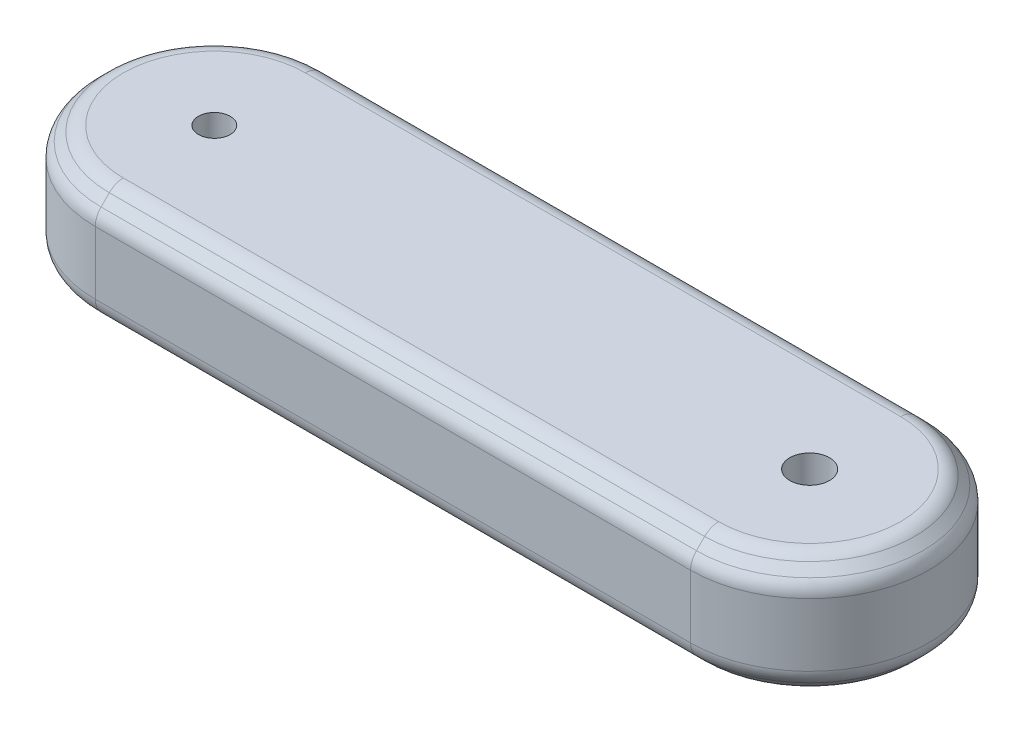
ISO-10303-21;
HEADER;
FILE_DESCRIPTION(('STEP AP214'),'2;1');
FILE_NAME('part.step','',(''),(''),'','','');
FILE_SCHEMA(('AUTOMOTIVE_DESIGN { 1 0 10303 214 1 1 1 1 }'));
ENDSEC;
DATA;
#1=APPLICATION_CONTEXT('core data for automotive mechanical design processes');
#2=APPLICATION_PROTOCOL_DEFINITION('international standard','automotive_design',2000,#1);
#3=PRODUCT_CONTEXT('',#1,'mechanical');
#4=PRODUCT('Part','Part','',(#3));
#5=PRODUCT_RELATED_PRODUCT_CATEGORY('part','',(#4));
#6=PRODUCT_DEFINITION_FORMATION('','',#4);
#7=PRODUCT_DEFINITION_CONTEXT('part definition',#1,'design');
#8=PRODUCT_DEFINITION('design','',#6,#7);
#9=PRODUCT_DEFINITION_SHAPE('','',#8);
#10=(LENGTH_UNIT() NAMED_UNIT(*) SI_UNIT(.MILLI.,.METRE.));
#11=(NAMED_UNIT(*) PLANE_ANGLE_UNIT() SI_UNIT($,.RADIAN.));
#12=(NAMED_UNIT(*) SI_UNIT($,.STERADIAN.) SOLID_ANGLE_UNIT());
#13=UNCERTAINTY_MEASURE_WITH_UNIT(LENGTH_MEASURE(1.E-05),#10,'distance_accuracy_value','');
#14=(GEOMETRIC_REPRESENTATION_CONTEXT(3) GLOBAL_UNCERTAINTY_ASSIGNED_CONTEXT((#13)) GLOBAL_UNIT_ASSIGNED_CONTEXT((#10,
#11,#12)) REPRESENTATION_CONTEXT('',''));
#15=CARTESIAN_POINT('',(0.,0.,0.));
#16=DIRECTION('',(0.,0.,1.));
#17=DIRECTION('',(1.,0.,0.));
#18=AXIS2_PLACEMENT_3D('',#15,#16,#17);
#19=CARTESIAN_POINT('',(-75.,30.,0.));
#20=DIRECTION('',(0.,-1.,0.));
#21=DIRECTION('',(0.,0.,-1.));
#22=AXIS2_PLACEMENT_3D('',#19,#20,#21);
#23=CYLINDRICAL_SURFACE('',#22,30.);
#24=DIRECTION('',(0.,-1.,0.));
#25=VECTOR('',#24,1.);
#26=CARTESIAN_POINT('',(-75.,30.,30.));
#27=LINE('',#26,#25);
#28=CARTESIAN_POINT('',(-75.,22.9289321881345,30.));
#29=VERTEX_POINT('',#28);
#30=CARTESIAN_POINT('',(-75.,7.07106781186547,30.));
#31=VERTEX_POINT('',#30);
#32=EDGE_CURVE('E194',#29,#31,#27,.T.);
#33=ORIENTED_EDGE('',*,*,#32,.F.);
#34=CARTESIAN_POINT('',(-75.,22.9289321881345,0.));
#35=DIRECTION('',(0.,1.,0.));
#36=DIRECTION('',(0.,0.,1.));
#37=AXIS2_PLACEMENT_3D('',#34,#35,#36);
#38=CIRCLE('',#37,30.);
#39=CARTESIAN_POINT('',(-75.,22.9289321881345,-30.));
#40=VERTEX_POINT('',#39);
#41=EDGE_CURVE('E269',#29,#40,#38,.F.);
#42=ORIENTED_EDGE('',*,*,#41,.T.);
#43=DIRECTION('',(0.,-1.,0.));
#44=VECTOR('',#43,1.);
#45=CARTESIAN_POINT('',(-75.,30.,-30.));
#46=LINE('',#45,#44);
#47=CARTESIAN_POINT('',(-75.,7.07106781186549,-30.));
#48=VERTEX_POINT('',#47);
#49=EDGE_CURVE('E182',#40,#48,#46,.T.);
#50=ORIENTED_EDGE('',*,*,#49,.T.);
#51=CARTESIAN_POINT('',(-75.,7.07106781186547,0.));
#52=DIRECTION('',(0.,-1.,0.));
#53=DIRECTION('',(0.,0.,-1.));
#54=AXIS2_PLACEMENT_3D('',#51,#52,#53);
#55=CIRCLE('',#54,30.);
#56=EDGE_CURVE('E267',#48,#31,#55,.F.);
#57=ORIENTED_EDGE('',*,*,#56,.T.);
#58=EDGE_LOOP('',(#33,#42,#50,#57));
#59=FACE_BOUND('',#58,.T.);
#60=ADVANCED_FACE('F37',(#59),#23,.T.);
#61=CARTESIAN_POINT('',(-75.,30.,30.));
#62=DIRECTION('',(0.,0.,-1.));
#63=DIRECTION('',(-1.,0.,0.));
#64=AXIS2_PLACEMENT_3D('',#61,#62,#63);
#65=PLANE('',#64);
#66=DIRECTION('',(0.,-1.,0.));
#67=VECTOR('',#66,1.);
#68=CARTESIAN_POINT('',(75.,30.,30.));
#69=LINE('',#68,#67);
#70=CARTESIAN_POINT('',(75.,22.9289321881345,30.));
#71=VERTEX_POINT('',#70);
#72=CARTESIAN_POINT('',(75.,7.07106781186549,30.));
#73=VERTEX_POINT('',#72);
#74=EDGE_CURVE('E191',#71,#73,#69,.T.);
#75=ORIENTED_EDGE('',*,*,#74,.F.);
#76=DIRECTION('',(-1.,0.,0.));
#77=VECTOR('',#76,1.);
#78=CARTESIAN_POINT('',(-75.,22.9289321881345,30.));
#79=LINE('',#78,#77);
#80=EDGE_CURVE('E274',#71,#29,#79,.T.);
#81=ORIENTED_EDGE('',*,*,#80,.T.);
#82=ORIENTED_EDGE('',*,*,#32,.T.);
#83=DIRECTION('',(-1.,0.,0.));
#84=VECTOR('',#83,1.);
#85=CARTESIAN_POINT('',(75.,7.07106781186549,30.));
#86=LINE('',#85,#84);
#87=EDGE_CURVE('E272',#31,#73,#86,.F.);
#88=ORIENTED_EDGE('',*,*,#87,.T.);
#89=EDGE_LOOP('',(#75,#81,#82,#88));
#90=FACE_BOUND('',#89,.T.);
#91=ADVANCED_FACE('F384',(#90),#65,.F.);
#92=CARTESIAN_POINT('',(75.,30.,0.));
#93=DIRECTION('',(0.,-1.,0.));
#94=DIRECTION('',(0.,0.,-1.));
#95=AXIS2_PLACEMENT_3D('',#92,#93,#94);
#96=CYLINDRICAL_SURFACE('',#95,30.);
#97=DIRECTION('',(0.,-1.,0.));
#98=VECTOR('',#97,1.);
#99=CARTESIAN_POINT('',(75.,30.,-30.));
#100=LINE('',#99,#98);
#101=CARTESIAN_POINT('',(75.,22.9289321881345,-30.));
#102=VERTEX_POINT('',#101);
#103=CARTESIAN_POINT('',(75.,7.07106781186549,-30.));
#104=VERTEX_POINT('',#103);
#105=EDGE_CURVE('E189',#102,#104,#100,.T.);
#106=ORIENTED_EDGE('',*,*,#105,.F.);
#107=CARTESIAN_POINT('',(75.,22.9289321881345,0.));
#108=DIRECTION('',(0.,1.,0.));
#109=DIRECTION('',(0.,0.,1.));
#110=AXIS2_PLACEMENT_3D('',#107,#108,#109);
#111=CIRCLE('',#110,30.);
#112=EDGE_CURVE('E279',#102,#71,#111,.F.);
#113=ORIENTED_EDGE('',*,*,#112,.T.);
#114=ORIENTED_EDGE('',*,*,#74,.T.);
#115=CARTESIAN_POINT('',(75.,7.07106781186547,0.));
#116=DIRECTION('',(0.,-1.,0.));
#117=DIRECTION('',(0.,0.,-1.));
#118=AXIS2_PLACEMENT_3D('',#115,#116,#117);
#119=CIRCLE('',#118,30.);
#120=EDGE_CURVE('E276',#73,#104,#119,.F.);
#121=ORIENTED_EDGE('',*,*,#120,.T.);
#122=EDGE_LOOP('',(#106,#113,#114,#121));
#123=FACE_BOUND('',#122,.T.);
#124=ADVANCED_FACE('F389',(#123),#96,.T.);
#125=CARTESIAN_POINT('',(-75.,30.,-30.));
#126=DIRECTION('',(0.,0.,1.));
#127=DIRECTION('',(1.,0.,0.));
#128=AXIS2_PLACEMENT_3D('',#125,#126,#127);
#129=PLANE('',#128);
#130=ORIENTED_EDGE('',*,*,#49,.F.);
#131=DIRECTION('',(1.,0.,0.));
#132=VECTOR('',#131,1.);
#133=CARTESIAN_POINT('',(75.,22.9289321881345,-30.));
#134=LINE('',#133,#132);
#135=EDGE_CURVE('E11',#40,#102,#134,.T.);
#136=ORIENTED_EDGE('',*,*,#135,.T.);
#137=ORIENTED_EDGE('',*,*,#105,.T.);
#138=DIRECTION('',(1.,0.,0.));
#139=VECTOR('',#138,1.);
#140=CARTESIAN_POINT('',(-75.,7.07106781186549,-30.));
#141=LINE('',#140,#139);
#142=EDGE_CURVE('E46',#104,#48,#141,.F.);
#143=ORIENTED_EDGE('',*,*,#142,.T.);
#144=EDGE_LOOP('',(#130,#136,#137,#143));
#145=FACE_BOUND('',#144,.T.);
#146=ADVANCED_FACE('F396',(#145),#129,.F.);
#147=CARTESIAN_POINT('',(-75.,30.,0.));
#148=DIRECTION('',(0.,1.,0.));
#149=DIRECTION('',(0.,0.,1.));
#150=AXIS2_PLACEMENT_3D('',#147,#148,#149);
#151=PLANE('',#150);
#152=CARTESIAN_POINT('',(-75.,30.,0.));
#153=DIRECTION('',(0.,1.,0.));
#154=DIRECTION('',(0.,0.,1.));
#155=AXIS2_PLACEMENT_3D('',#152,#153,#154);
#156=CIRCLE('',#155,4.);
#157=CARTESIAN_POINT('',(-75.,30.,4.00000000000001));
#158=VERTEX_POINT('',#157);
#159=EDGE_CURVE('E168',#158,#158,#156,.T.);
#160=ORIENTED_EDGE('',*,*,#159,.F.);
#161=EDGE_LOOP('',(#160));
#162=FACE_BOUND('',#161,.T.);
#163=DIRECTION('',(1.,0.,0.));
#164=VECTOR('',#163,1.);
#165=CARTESIAN_POINT('',(-75.,30.,22.9289321881345));
#166=LINE('',#165,#164);
#167=CARTESIAN_POINT('',(-75.,30.,22.9289321881345));
#168=VERTEX_POINT('',#167);
#169=CARTESIAN_POINT('',(75.,30.,22.9289321881345));
#170=VERTEX_POINT('',#169);
#171=EDGE_CURVE('E248',#168,#170,#166,.T.);
#172=ORIENTED_EDGE('',*,*,#171,.T.);
#173=CARTESIAN_POINT('',(75.,30.,0.));
#174=DIRECTION('',(0.,1.,0.));
#175=DIRECTION('',(0.,0.,1.));
#176=AXIS2_PLACEMENT_3D('',#173,#174,#175);
#177=CIRCLE('',#176,22.9289321881345);
#178=CARTESIAN_POINT('',(75.,30.,-22.9289321881345));
#179=VERTEX_POINT('',#178);
#180=EDGE_CURVE('E250',#170,#179,#177,.T.);
#181=ORIENTED_EDGE('',*,*,#180,.T.);
#182=DIRECTION('',(-1.,0.,0.));
#183=VECTOR('',#182,1.);
#184=CARTESIAN_POINT('',(-75.,30.,-22.9289321881345));
#185=LINE('',#184,#183);
#186=CARTESIAN_POINT('',(-75.,30.,-22.9289321881345));
#187=VERTEX_POINT('',#186);
#188=EDGE_CURVE('E244',#179,#187,#185,.T.);
#189=ORIENTED_EDGE('',*,*,#188,.T.);
#190=CARTESIAN_POINT('',(-75.,30.,0.));
#191=DIRECTION('',(0.,1.,0.));
#192=DIRECTION('',(0.,0.,1.));
#193=AXIS2_PLACEMENT_3D('',#190,#191,#192);
#194=CIRCLE('',#193,22.9289321881345);
#195=EDGE_CURVE('E246',#187,#168,#194,.T.);
#196=ORIENTED_EDGE('',*,*,#195,.T.);
#197=EDGE_LOOP('',(#172,#181,#189,#196));
#198=FACE_BOUND('',#197,.T.);
#199=CARTESIAN_POINT('',(75.,30.,0.));
#200=DIRECTION('',(0.,1.,0.));
#201=DIRECTION('',(0.,0.,1.));
#202=AXIS2_PLACEMENT_3D('',#199,#200,#201);
#203=CIRCLE('',#202,5.);
#204=CARTESIAN_POINT('',(75.,30.,5.00000000000001));
#205=VERTEX_POINT('',#204);
#206=EDGE_CURVE('E183',#205,#205,#203,.T.);
#207=ORIENTED_EDGE('',*,*,#206,.F.);
#208=EDGE_LOOP('',(#207));
#209=FACE_BOUND('',#208,.T.);
#210=ADVANCED_FACE('F400',(#162,#198,#209),#151,.T.);
#211=CARTESIAN_POINT('',(-75.,0.,0.));
#212=DIRECTION('',(0.,1.,0.));
#213=DIRECTION('',(0.,0.,1.));
#214=AXIS2_PLACEMENT_3D('',#211,#212,#213);
#215=PLANE('',#214);
#216=CARTESIAN_POINT('',(-75.,0.,0.));
#217=DIRECTION('',(0.,-1.,0.));
#218=DIRECTION('',(0.,0.,-1.));
#219=AXIS2_PLACEMENT_3D('',#216,#217,#218);
#220=CIRCLE('',#219,4.);
#221=CARTESIAN_POINT('',(-75.,0.,-4.));
#222=VERTEX_POINT('',#221);
#223=EDGE_CURVE('E169',#222,#222,#220,.T.);
#224=ORIENTED_EDGE('',*,*,#223,.F.);
#225=EDGE_LOOP('',(#224));
#226=FACE_BOUND('',#225,.T.);
#227=DIRECTION('',(-1.,0.,0.));
#228=VECTOR('',#227,1.);
#229=CARTESIAN_POINT('',(75.,0.,-22.9289321881345));
#230=LINE('',#229,#228);
#231=CARTESIAN_POINT('',(-75.,0.,-22.9289321881345));
#232=VERTEX_POINT('',#231);
#233=CARTESIAN_POINT('',(75.,0.,-22.9289321881345));
#234=VERTEX_POINT('',#233);
#235=EDGE_CURVE('E225',#232,#234,#230,.F.);
#236=ORIENTED_EDGE('',*,*,#235,.T.);
#237=CARTESIAN_POINT('',(75.,0.,0.));
#238=DIRECTION('',(0.,1.,0.));
#239=DIRECTION('',(0.,0.,1.));
#240=AXIS2_PLACEMENT_3D('',#237,#238,#239);
#241=CIRCLE('',#240,22.9289321881345);
#242=CARTESIAN_POINT('',(75.,0.,22.9289321881345));
#243=VERTEX_POINT('',#242);
#244=EDGE_CURVE('E227',#234,#243,#241,.F.);
#245=ORIENTED_EDGE('',*,*,#244,.T.);
#246=DIRECTION('',(1.,0.,0.));
#247=VECTOR('',#246,1.);
#248=CARTESIAN_POINT('',(-75.,0.,22.9289321881345));
#249=LINE('',#248,#247);
#250=CARTESIAN_POINT('',(-75.,0.,22.9289321881345));
#251=VERTEX_POINT('',#250);
#252=EDGE_CURVE('E197',#243,#251,#249,.F.);
#253=ORIENTED_EDGE('',*,*,#252,.T.);
#254=CARTESIAN_POINT('',(-75.,0.,0.));
#255=DIRECTION('',(0.,1.,0.));
#256=DIRECTION('',(0.,0.,1.));
#257=AXIS2_PLACEMENT_3D('',#254,#255,#256);
#258=CIRCLE('',#257,22.9289321881345);
#259=EDGE_CURVE('E223',#251,#232,#258,.F.);
#260=ORIENTED_EDGE('',*,*,#259,.T.);
#261=EDGE_LOOP('',(#236,#245,#253,#260));
#262=FACE_BOUND('',#261,.T.);
#263=CARTESIAN_POINT('',(75.,0.,0.));
#264=DIRECTION('',(0.,1.,0.));
#265=DIRECTION('',(0.,0.,1.));
#266=AXIS2_PLACEMENT_3D('',#263,#264,#265);
#267=CIRCLE('',#266,5.);
#268=CARTESIAN_POINT('',(75.,0.,5.00000000000001));
#269=VERTEX_POINT('',#268);
#270=EDGE_CURVE('E179',#269,#269,#267,.T.);
#271=ORIENTED_EDGE('',*,*,#270,.T.);
#272=EDGE_LOOP('',(#271));
#273=FACE_BOUND('',#272,.T.);
#274=ADVANCED_FACE('F365',(#226,#262,#273),#215,.F.);
#275=CARTESIAN_POINT('',(75.,0.,0.));
#276=DIRECTION('',(0.,1.,0.));
#277=DIRECTION('',(0.,0.,1.));
#278=AXIS2_PLACEMENT_3D('',#275,#276,#277);
#279=CYLINDRICAL_SURFACE('',#278,5.);
#280=ORIENTED_EDGE('',*,*,#270,.F.);
#281=EDGE_LOOP('',(#280));
#282=FACE_BOUND('',#281,.T.);
#283=ORIENTED_EDGE('',*,*,#206,.T.);
#284=EDGE_LOOP('',(#283));
#285=FACE_BOUND('',#284,.T.);
#286=ADVANCED_FACE('F403',(#282,#285),#279,.F.);
#287=CARTESIAN_POINT('',(-75.,5.,-30.));
#288=DIRECTION('',(0.,0.707106781186549,0.707106781186545));
#289=DIRECTION('',(-1.,0.,0.));
#290=AXIS2_PLACEMENT_3D('',#287,#288,#289);
#291=PLANE('',#290);
#292=DIRECTION('',(0.,0.707106781186545,-0.707106781186549));
#293=VECTOR('',#292,1.);
#294=CARTESIAN_POINT('',(75.,0.,-25.));
#295=LINE('',#294,#293);
#296=CARTESIAN_POINT('',(75.,1.46446609406725,-26.4644660940672));
#297=VERTEX_POINT('',#296);
#298=CARTESIAN_POINT('',(75.,3.53553390593274,-28.5355339059327));
#299=VERTEX_POINT('',#298);
#300=EDGE_CURVE('E205',#297,#299,#295,.T.);
#301=ORIENTED_EDGE('',*,*,#300,.F.);
#302=DIRECTION('',(1.,0.,0.));
#303=VECTOR('',#302,1.);
#304=CARTESIAN_POINT('',(-75.,1.46446609406725,-26.4644660940672));
#305=LINE('',#304,#303);
#306=CARTESIAN_POINT('',(-75.,1.46446609406725,-26.4644660940672));
#307=VERTEX_POINT('',#306);
#308=EDGE_CURVE('E238',#297,#307,#305,.F.);
#309=ORIENTED_EDGE('',*,*,#308,.T.);
#310=DIRECTION('',(0.,-0.707106781186545,0.707106781186549));
#311=VECTOR('',#310,1.);
#312=CARTESIAN_POINT('',(-75.,5.,-30.));
#313=LINE('',#312,#311);
#314=CARTESIAN_POINT('',(-75.,3.53553390593274,-28.5355339059327));
#315=VERTEX_POINT('',#314);
#316=EDGE_CURVE('E186',#315,#307,#313,.T.);
#317=ORIENTED_EDGE('',*,*,#316,.F.);
#318=DIRECTION('',(-1.,0.,0.));
#319=VECTOR('',#318,1.);
#320=CARTESIAN_POINT('',(75.,3.53553390593274,-28.5355339059327));
#321=LINE('',#320,#319);
#322=EDGE_CURVE('E236',#315,#299,#321,.F.);
#323=ORIENTED_EDGE('',*,*,#322,.T.);
#324=EDGE_LOOP('',(#301,#309,#317,#323));
#325=FACE_BOUND('',#324,.T.);
#326=ADVANCED_FACE('F343',(#325),#291,.F.);
#327=CARTESIAN_POINT('',(-75.,5.,0.));
#328=DIRECTION('',(0.,1.,0.));
#329=DIRECTION('',(0.,0.,1.));
#330=AXIS2_PLACEMENT_3D('',#327,#328,#329);
#331=CONICAL_SURFACE('',#330,30.,0.785398163397451);
#332=ORIENTED_EDGE('',*,*,#316,.T.);
#333=CARTESIAN_POINT('',(-75.,1.46446609406726,0.));
#334=DIRECTION('',(0.,1.,0.));
#335=DIRECTION('',(0.,0.,1.));
#336=AXIS2_PLACEMENT_3D('',#333,#334,#335);
#337=CIRCLE('',#336,26.4644660940672);
#338=CARTESIAN_POINT('',(-75.,1.46446609406725,26.4644660940672));
#339=VERTEX_POINT('',#338);
#340=EDGE_CURVE('E242',#307,#339,#337,.T.);
#341=ORIENTED_EDGE('',*,*,#340,.T.);
#342=DIRECTION('',(0.,-0.707106781186545,-0.707106781186549));
#343=VECTOR('',#342,1.);
#344=CARTESIAN_POINT('',(-75.,5.,30.));
#345=LINE('',#344,#343);
#346=CARTESIAN_POINT('',(-75.,3.53553390593273,28.5355339059327));
#347=VERTEX_POINT('',#346);
#348=EDGE_CURVE('E201',#347,#339,#345,.T.);
#349=ORIENTED_EDGE('',*,*,#348,.F.);
#350=CARTESIAN_POINT('',(-75.,3.53553390593273,0.));
#351=DIRECTION('',(0.,1.,0.));
#352=DIRECTION('',(0.,0.,1.));
#353=AXIS2_PLACEMENT_3D('',#350,#351,#352);
#354=CIRCLE('',#353,28.5355339059327);
#355=EDGE_CURVE('E240',#347,#315,#354,.F.);
#356=ORIENTED_EDGE('',*,*,#355,.T.);
#357=EDGE_LOOP('',(#332,#341,#349,#356));
#358=FACE_BOUND('',#357,.T.);
#359=ADVANCED_FACE('F339',(#358),#331,.T.);
#360=CARTESIAN_POINT('',(75.,5.,0.));
#361=DIRECTION('',(0.,1.,0.));
#362=DIRECTION('',(0.,0.,1.));
#363=AXIS2_PLACEMENT_3D('',#360,#361,#362);
#364=CONICAL_SURFACE('',#363,30.,0.785398163397451);
#365=DIRECTION('',(0.,0.707106781186545,0.707106781186549));
#366=VECTOR('',#365,1.);
#367=CARTESIAN_POINT('',(75.,0.,25.));
#368=LINE('',#367,#366);
#369=CARTESIAN_POINT('',(75.,1.46446609406725,26.4644660940672));
#370=VERTEX_POINT('',#369);
#371=CARTESIAN_POINT('',(75.,3.53553390593274,28.5355339059327));
#372=VERTEX_POINT('',#371);
#373=EDGE_CURVE('E198',#370,#372,#368,.T.);
#374=ORIENTED_EDGE('',*,*,#373,.F.);
#375=CARTESIAN_POINT('',(75.,1.46446609406726,0.));
#376=DIRECTION('',(0.,1.,0.));
#377=DIRECTION('',(0.,0.,1.));
#378=AXIS2_PLACEMENT_3D('',#375,#376,#377);
#379=CIRCLE('',#378,26.4644660940672);
#380=EDGE_CURVE('E233',#370,#297,#379,.T.);
#381=ORIENTED_EDGE('',*,*,#380,.T.);
#382=ORIENTED_EDGE('',*,*,#300,.T.);
#383=CARTESIAN_POINT('',(75.,3.53553390593273,0.));
#384=DIRECTION('',(0.,1.,0.));
#385=DIRECTION('',(0.,0.,1.));
#386=AXIS2_PLACEMENT_3D('',#383,#384,#385);
#387=CIRCLE('',#386,28.5355339059327);
#388=EDGE_CURVE('E230',#299,#372,#387,.F.);
#389=ORIENTED_EDGE('',*,*,#388,.T.);
#390=EDGE_LOOP('',(#374,#381,#382,#389));
#391=FACE_BOUND('',#390,.T.);
#392=ADVANCED_FACE('F354',(#391),#364,.T.);
#393=CARTESIAN_POINT('',(-75.,5.,30.));
#394=DIRECTION('',(0.,0.707106781186549,-0.707106781186545));
#395=DIRECTION('',(1.,0.,0.));
#396=AXIS2_PLACEMENT_3D('',#393,#394,#395);
#397=PLANE('',#396);
#398=ORIENTED_EDGE('',*,*,#373,.T.);
#399=DIRECTION('',(1.,0.,0.));
#400=VECTOR('',#399,1.);
#401=CARTESIAN_POINT('',(-75.,3.53553390593274,28.5355339059327));
#402=LINE('',#401,#400);
#403=EDGE_CURVE('E283',#372,#347,#402,.F.);
#404=ORIENTED_EDGE('',*,*,#403,.T.);
#405=ORIENTED_EDGE('',*,*,#348,.T.);
#406=DIRECTION('',(-1.,0.,0.));
#407=VECTOR('',#406,1.);
#408=CARTESIAN_POINT('',(75.,1.46446609406725,26.4644660940672));
#409=LINE('',#408,#407);
#410=EDGE_CURVE('E281',#339,#370,#409,.F.);
#411=ORIENTED_EDGE('',*,*,#410,.T.);
#412=EDGE_LOOP('',(#398,#404,#405,#411));
#413=FACE_BOUND('',#412,.T.);
#414=ADVANCED_FACE('F370',(#413),#397,.F.);
#415=CARTESIAN_POINT('',(-75.,30.,-25.));
#416=DIRECTION('',(0.,0.707106781186545,-0.707106781186549));
#417=DIRECTION('',(1.,0.,0.));
#418=AXIS2_PLACEMENT_3D('',#415,#416,#417);
#419=PLANE('',#418);
#420=DIRECTION('',(0.,-0.707106781186549,-0.707106781186545));
#421=VECTOR('',#420,1.);
#422=CARTESIAN_POINT('',(-75.,30.,-25.));
#423=LINE('',#422,#421);
#424=CARTESIAN_POINT('',(-75.,28.5355339059327,-26.4644660940672));
#425=VERTEX_POINT('',#424);
#426=CARTESIAN_POINT('',(-75.,26.4644660940672,-28.5355339059327));
#427=VERTEX_POINT('',#426);
#428=EDGE_CURVE('E202',#425,#427,#423,.T.);
#429=ORIENTED_EDGE('',*,*,#428,.F.);
#430=DIRECTION('',(-1.,0.,0.));
#431=VECTOR('',#430,1.);
#432=CARTESIAN_POINT('',(-75.,28.5355339059327,-26.4644660940672));
#433=LINE('',#432,#431);
#434=CARTESIAN_POINT('',(75.,28.5355339059327,-26.4644660940673));
#435=VERTEX_POINT('',#434);
#436=EDGE_CURVE('E287',#425,#435,#433,.F.);
#437=ORIENTED_EDGE('',*,*,#436,.T.);
#438=DIRECTION('',(0.,0.707106781186549,0.707106781186545));
#439=VECTOR('',#438,1.);
#440=CARTESIAN_POINT('',(75.,25.,-30.));
#441=LINE('',#440,#439);
#442=CARTESIAN_POINT('',(75.,26.4644660940672,-28.5355339059327));
#443=VERTEX_POINT('',#442);
#444=EDGE_CURVE('E217',#443,#435,#441,.T.);
#445=ORIENTED_EDGE('',*,*,#444,.F.);
#446=DIRECTION('',(1.,0.,0.));
#447=VECTOR('',#446,1.);
#448=CARTESIAN_POINT('',(-75.,26.4644660940672,-28.5355339059327));
#449=LINE('',#448,#447);
#450=EDGE_CURVE('E285',#443,#427,#449,.F.);
#451=ORIENTED_EDGE('',*,*,#450,.T.);
#452=EDGE_LOOP('',(#429,#437,#445,#451));
#453=FACE_BOUND('',#452,.T.);
#454=ADVANCED_FACE('F372',(#453),#419,.T.);
#455=CARTESIAN_POINT('',(-75.,30.,0.));
#456=DIRECTION('',(0.,-1.,0.));
#457=DIRECTION('',(0.,0.,-1.));
#458=AXIS2_PLACEMENT_3D('',#455,#456,#457);
#459=CONICAL_SURFACE('',#458,25.,0.785398163397446);
#460=DIRECTION('',(0.,-0.707106781186549,0.707106781186545));
#461=VECTOR('',#460,1.);
#462=CARTESIAN_POINT('',(-75.,30.,25.));
#463=LINE('',#462,#461);
#464=CARTESIAN_POINT('',(-75.,28.5355339059327,26.4644660940673));
#465=VERTEX_POINT('',#464);
#466=CARTESIAN_POINT('',(-75.,26.4644660940672,28.5355339059327));
#467=VERTEX_POINT('',#466);
#468=EDGE_CURVE('E213',#465,#467,#463,.T.);
#469=ORIENTED_EDGE('',*,*,#468,.F.);
#470=CARTESIAN_POINT('',(-75.,28.5355339059327,0.));
#471=DIRECTION('',(0.,1.,0.));
#472=DIRECTION('',(0.,0.,1.));
#473=AXIS2_PLACEMENT_3D('',#470,#471,#472);
#474=CIRCLE('',#473,26.4644660940672);
#475=EDGE_CURVE('E265',#465,#425,#474,.F.);
#476=ORIENTED_EDGE('',*,*,#475,.T.);
#477=ORIENTED_EDGE('',*,*,#428,.T.);
#478=CARTESIAN_POINT('',(-75.,26.4644660940672,0.));
#479=DIRECTION('',(0.,-1.,0.));
#480=DIRECTION('',(0.,0.,-1.));
#481=AXIS2_PLACEMENT_3D('',#478,#479,#480);
#482=CIRCLE('',#481,28.5355339059327);
#483=EDGE_CURVE('E262',#427,#467,#482,.F.);
#484=ORIENTED_EDGE('',*,*,#483,.T.);
#485=EDGE_LOOP('',(#469,#476,#477,#484));
#486=FACE_BOUND('',#485,.T.);
#487=ADVANCED_FACE('F378',(#486),#459,.T.);
#488=CARTESIAN_POINT('',(75.,30.,0.));
#489=DIRECTION('',(0.,-1.,0.));
#490=DIRECTION('',(0.,0.,-1.));
#491=AXIS2_PLACEMENT_3D('',#488,#489,#490);
#492=CONICAL_SURFACE('',#491,25.,0.785398163397446);
#493=ORIENTED_EDGE('',*,*,#444,.T.);
#494=CARTESIAN_POINT('',(75.,28.5355339059327,0.));
#495=DIRECTION('',(0.,1.,0.));
#496=DIRECTION('',(0.,0.,1.));
#497=AXIS2_PLACEMENT_3D('',#494,#495,#496);
#498=CIRCLE('',#497,26.4644660940672);
#499=CARTESIAN_POINT('',(75.,28.5355339059327,26.4644660940673));
#500=VERTEX_POINT('',#499);
#501=EDGE_CURVE('E255',#435,#500,#498,.F.);
#502=ORIENTED_EDGE('',*,*,#501,.T.);
#503=DIRECTION('',(0.,0.707106781186549,-0.707106781186545));
#504=VECTOR('',#503,1.);
#505=CARTESIAN_POINT('',(75.,25.,30.));
#506=LINE('',#505,#504);
#507=CARTESIAN_POINT('',(75.,26.4644660940672,28.5355339059327));
#508=VERTEX_POINT('',#507);
#509=EDGE_CURVE('E210',#508,#500,#506,.T.);
#510=ORIENTED_EDGE('',*,*,#509,.F.);
#511=CARTESIAN_POINT('',(75.,26.4644660940672,0.));
#512=DIRECTION('',(0.,-1.,0.));
#513=DIRECTION('',(0.,0.,-1.));
#514=AXIS2_PLACEMENT_3D('',#511,#512,#513);
#515=CIRCLE('',#514,28.5355339059327);
#516=EDGE_CURVE('E253',#508,#443,#515,.F.);
#517=ORIENTED_EDGE('',*,*,#516,.T.);
#518=EDGE_LOOP('',(#493,#502,#510,#517));
#519=FACE_BOUND('',#518,.T.);
#520=ADVANCED_FACE('F556',(#519),#492,.T.);
#521=CARTESIAN_POINT('',(-75.,30.,25.));
#522=DIRECTION('',(0.,0.707106781186545,0.707106781186549));
#523=DIRECTION('',(-1.,0.,0.));
#524=AXIS2_PLACEMENT_3D('',#521,#522,#523);
#525=PLANE('',#524);
#526=ORIENTED_EDGE('',*,*,#509,.T.);
#527=DIRECTION('',(1.,0.,0.));
#528=VECTOR('',#527,1.);
#529=CARTESIAN_POINT('',(-75.,28.5355339059327,26.4644660940673));
#530=LINE('',#529,#528);
#531=EDGE_CURVE('E260',#500,#465,#530,.F.);
#532=ORIENTED_EDGE('',*,*,#531,.T.);
#533=ORIENTED_EDGE('',*,*,#468,.T.);
#534=DIRECTION('',(-1.,0.,0.));
#535=VECTOR('',#534,1.);
#536=CARTESIAN_POINT('',(75.,26.4644660940672,28.5355339059327));
#537=LINE('',#536,#535);
#538=EDGE_CURVE('E258',#467,#508,#537,.F.);
#539=ORIENTED_EDGE('',*,*,#538,.T.);
#540=EDGE_LOOP('',(#526,#532,#533,#539));
#541=FACE_BOUND('',#540,.T.);
#542=ADVANCED_FACE('F549',(#541),#525,.T.);
#543=CARTESIAN_POINT('',(-75.,5.,0.));
#544=DIRECTION('',(0.,1.,0.));
#545=DIRECTION('',(0.,0.,1.));
#546=AXIS2_PLACEMENT_3D('',#543,#544,#545);
#547=TOROIDAL_SURFACE('',#546,22.9289321881345,5.);
#548=CARTESIAN_POINT('',(-75.,5.,22.9289321881345));
#549=DIRECTION('',(1.,0.,0.));
#550=DIRECTION('',(0.,0.,-1.));
#551=AXIS2_PLACEMENT_3D('',#548,#549,#550);
#552=CIRCLE('',#551,5.);
#553=EDGE_CURVE('E295',#339,#251,#552,.T.);
#554=ORIENTED_EDGE('',*,*,#553,.F.);
#555=ORIENTED_EDGE('',*,*,#340,.F.);
#556=CARTESIAN_POINT('',(-75.,5.,-22.9289321881345));
#557=DIRECTION('',(1.,0.,0.));
#558=DIRECTION('',(0.,0.,-1.));
#559=AXIS2_PLACEMENT_3D('',#556,#557,#558);
#560=CIRCLE('',#559,5.);
#561=EDGE_CURVE('E214',#232,#307,#560,.T.);
#562=ORIENTED_EDGE('',*,*,#561,.F.);
#563=ORIENTED_EDGE('',*,*,#259,.F.);
#564=EDGE_LOOP('',(#554,#555,#562,#563));
#565=FACE_BOUND('',#564,.T.);
#566=ADVANCED_FACE('F368',(#565),#547,.T.);
#567=CARTESIAN_POINT('',(-75.,5.,-22.9289321881345));
#568=DIRECTION('',(1.,0.,0.));
#569=DIRECTION('',(0.,0.,-1.));
#570=AXIS2_PLACEMENT_3D('',#567,#568,#569);
#571=CYLINDRICAL_SURFACE('',#570,5.);
#572=ORIENTED_EDGE('',*,*,#561,.T.);
#573=ORIENTED_EDGE('',*,*,#308,.F.);
#574=CARTESIAN_POINT('',(75.,5.,-22.9289321881345));
#575=DIRECTION('',(1.,0.,0.));
#576=DIRECTION('',(0.,0.,-1.));
#577=AXIS2_PLACEMENT_3D('',#574,#575,#576);
#578=CIRCLE('',#577,5.);
#579=EDGE_CURVE('E292',#234,#297,#578,.T.);
#580=ORIENTED_EDGE('',*,*,#579,.F.);
#581=ORIENTED_EDGE('',*,*,#235,.F.);
#582=EDGE_LOOP('',(#572,#573,#580,#581));
#583=FACE_BOUND('',#582,.T.);
#584=ADVANCED_FACE('F347',(#583),#571,.T.);
#585=CARTESIAN_POINT('',(-75.,5.,22.9289321881345));
#586=DIRECTION('',(-1.,0.,0.));
#587=DIRECTION('',(0.,0.,1.));
#588=AXIS2_PLACEMENT_3D('',#585,#586,#587);
#589=CYLINDRICAL_SURFACE('',#588,5.);
#590=ORIENTED_EDGE('',*,*,#553,.T.);
#591=ORIENTED_EDGE('',*,*,#252,.F.);
#592=CARTESIAN_POINT('',(75.,5.,22.9289321881345));
#593=DIRECTION('',(1.,0.,0.));
#594=DIRECTION('',(0.,0.,-1.));
#595=AXIS2_PLACEMENT_3D('',#592,#593,#594);
#596=CIRCLE('',#595,5.);
#597=EDGE_CURVE('E290',#370,#243,#596,.T.);
#598=ORIENTED_EDGE('',*,*,#597,.F.);
#599=ORIENTED_EDGE('',*,*,#410,.F.);
#600=EDGE_LOOP('',(#590,#591,#598,#599));
#601=FACE_BOUND('',#600,.T.);
#602=ADVANCED_FACE('F361',(#601),#589,.T.);
#603=CARTESIAN_POINT('',(75.,5.,0.));
#604=DIRECTION('',(0.,1.,0.));
#605=DIRECTION('',(0.,0.,1.));
#606=AXIS2_PLACEMENT_3D('',#603,#604,#605);
#607=TOROIDAL_SURFACE('',#606,22.9289321881345,5.);
#608=ORIENTED_EDGE('',*,*,#579,.T.);
#609=ORIENTED_EDGE('',*,*,#380,.F.);
#610=ORIENTED_EDGE('',*,*,#597,.T.);
#611=ORIENTED_EDGE('',*,*,#244,.F.);
#612=EDGE_LOOP('',(#608,#609,#610,#611));
#613=FACE_BOUND('',#612,.T.);
#614=ADVANCED_FACE('F357',(#613),#607,.T.);
#615=CARTESIAN_POINT('',(-75.,25.,0.));
#616=DIRECTION('',(0.,1.,0.));
#617=DIRECTION('',(0.,0.,1.));
#618=AXIS2_PLACEMENT_3D('',#615,#616,#617);
#619=TOROIDAL_SURFACE('',#618,22.9289321881345,5.);
#620=CARTESIAN_POINT('',(-75.,25.,-22.9289321881345));
#621=DIRECTION('',(1.,0.,0.));
#622=DIRECTION('',(0.,0.,-1.));
#623=AXIS2_PLACEMENT_3D('',#620,#621,#622);
#624=CIRCLE('',#623,5.);
#625=EDGE_CURVE('E305',#425,#187,#624,.T.);
#626=ORIENTED_EDGE('',*,*,#625,.F.);
#627=ORIENTED_EDGE('',*,*,#475,.F.);
#628=CARTESIAN_POINT('',(-75.,25.,22.9289321881345));
#629=DIRECTION('',(1.,0.,0.));
#630=DIRECTION('',(0.,0.,-1.));
#631=AXIS2_PLACEMENT_3D('',#628,#629,#630);
#632=CIRCLE('',#631,5.);
#633=EDGE_CURVE('E293',#168,#465,#632,.T.);
#634=ORIENTED_EDGE('',*,*,#633,.F.);
#635=ORIENTED_EDGE('',*,*,#195,.F.);
#636=EDGE_LOOP('',(#626,#627,#634,#635));
#637=FACE_BOUND('',#636,.T.);
#638=ADVANCED_FACE('F516',(#637),#619,.T.);
#639=CARTESIAN_POINT('',(-75.,25.,22.9289321881345));
#640=DIRECTION('',(1.,0.,0.));
#641=DIRECTION('',(0.,0.,-1.));
#642=AXIS2_PLACEMENT_3D('',#639,#640,#641);
#643=CYLINDRICAL_SURFACE('',#642,5.);
#644=ORIENTED_EDGE('',*,*,#633,.T.);
#645=ORIENTED_EDGE('',*,*,#531,.F.);
#646=CARTESIAN_POINT('',(75.,25.,22.9289321881345));
#647=DIRECTION('',(1.,0.,0.));
#648=DIRECTION('',(0.,0.,-1.));
#649=AXIS2_PLACEMENT_3D('',#646,#647,#648);
#650=CIRCLE('',#649,5.);
#651=EDGE_CURVE('E302',#170,#500,#650,.T.);
#652=ORIENTED_EDGE('',*,*,#651,.F.);
#653=ORIENTED_EDGE('',*,*,#171,.F.);
#654=EDGE_LOOP('',(#644,#645,#652,#653));
#655=FACE_BOUND('',#654,.T.);
#656=ADVANCED_FACE('F508',(#655),#643,.T.);
#657=CARTESIAN_POINT('',(-75.,25.,-22.9289321881345));
#658=DIRECTION('',(-1.,0.,0.));
#659=DIRECTION('',(0.,0.,1.));
#660=AXIS2_PLACEMENT_3D('',#657,#658,#659);
#661=CYLINDRICAL_SURFACE('',#660,5.);
#662=ORIENTED_EDGE('',*,*,#625,.T.);
#663=ORIENTED_EDGE('',*,*,#188,.F.);
#664=CARTESIAN_POINT('',(75.,25.,-22.9289321881345));
#665=DIRECTION('',(1.,0.,0.));
#666=DIRECTION('',(0.,0.,-1.));
#667=AXIS2_PLACEMENT_3D('',#664,#665,#666);
#668=CIRCLE('',#667,5.);
#669=EDGE_CURVE('E300',#435,#179,#668,.T.);
#670=ORIENTED_EDGE('',*,*,#669,.F.);
#671=ORIENTED_EDGE('',*,*,#436,.F.);
#672=EDGE_LOOP('',(#662,#663,#670,#671));
#673=FACE_BOUND('',#672,.T.);
#674=ADVANCED_FACE('F500',(#673),#661,.T.);
#675=CARTESIAN_POINT('',(75.,25.,0.));
#676=DIRECTION('',(0.,1.,0.));
#677=DIRECTION('',(0.,0.,1.));
#678=AXIS2_PLACEMENT_3D('',#675,#676,#677);
#679=TOROIDAL_SURFACE('',#678,22.9289321881345,5.);
#680=ORIENTED_EDGE('',*,*,#651,.T.);
#681=ORIENTED_EDGE('',*,*,#501,.F.);
#682=ORIENTED_EDGE('',*,*,#669,.T.);
#683=ORIENTED_EDGE('',*,*,#180,.F.);
#684=EDGE_LOOP('',(#680,#681,#682,#683));
#685=FACE_BOUND('',#684,.T.);
#686=ADVANCED_FACE('F492',(#685),#679,.T.);
#687=CARTESIAN_POINT('',(75.,22.9289321881345,0.));
#688=DIRECTION('',(0.,1.,0.));
#689=DIRECTION('',(0.,0.,1.));
#690=AXIS2_PLACEMENT_3D('',#687,#688,#689);
#691=TOROIDAL_SURFACE('',#690,25.,5.);
#692=CARTESIAN_POINT('',(75.,22.9289321881345,-25.));
#693=DIRECTION('',(-1.,0.,0.));
#694=DIRECTION('',(0.,0.,1.));
#695=AXIS2_PLACEMENT_3D('',#692,#693,#694);
#696=CIRCLE('',#695,5.);
#697=EDGE_CURVE('E314',#443,#102,#696,.T.);
#698=ORIENTED_EDGE('',*,*,#697,.F.);
#699=ORIENTED_EDGE('',*,*,#516,.F.);
#700=CARTESIAN_POINT('',(75.,22.9289321881345,25.));
#701=DIRECTION('',(-1.,0.,0.));
#702=DIRECTION('',(0.,0.,1.));
#703=AXIS2_PLACEMENT_3D('',#700,#701,#702);
#704=CIRCLE('',#703,5.);
#705=EDGE_CURVE('E303',#71,#508,#704,.T.);
#706=ORIENTED_EDGE('',*,*,#705,.F.);
#707=ORIENTED_EDGE('',*,*,#112,.F.);
#708=EDGE_LOOP('',(#698,#699,#706,#707));
#709=FACE_BOUND('',#708,.T.);
#710=ADVANCED_FACE('F484',(#709),#691,.T.);
#711=CARTESIAN_POINT('',(-75.,22.9289321881345,25.));
#712=DIRECTION('',(1.,0.,0.));
#713=DIRECTION('',(0.,0.,-1.));
#714=AXIS2_PLACEMENT_3D('',#711,#712,#713);
#715=CYLINDRICAL_SURFACE('',#714,5.);
#716=ORIENTED_EDGE('',*,*,#705,.T.);
#717=ORIENTED_EDGE('',*,*,#538,.F.);
#718=CARTESIAN_POINT('',(-75.,22.9289321881345,25.));
#719=DIRECTION('',(-1.,0.,0.));
#720=DIRECTION('',(0.,0.,1.));
#721=AXIS2_PLACEMENT_3D('',#718,#719,#720);
#722=CIRCLE('',#721,5.);
#723=EDGE_CURVE('E312',#29,#467,#722,.T.);
#724=ORIENTED_EDGE('',*,*,#723,.F.);
#725=ORIENTED_EDGE('',*,*,#80,.F.);
#726=EDGE_LOOP('',(#716,#717,#724,#725));
#727=FACE_BOUND('',#726,.T.);
#728=ADVANCED_FACE('F476',(#727),#715,.T.);
#729=CARTESIAN_POINT('',(-75.,22.9289321881345,-25.));
#730=DIRECTION('',(-1.,0.,0.));
#731=DIRECTION('',(0.,0.,1.));
#732=AXIS2_PLACEMENT_3D('',#729,#730,#731);
#733=CYLINDRICAL_SURFACE('',#732,5.);
#734=ORIENTED_EDGE('',*,*,#697,.T.);
#735=ORIENTED_EDGE('',*,*,#135,.F.);
#736=CARTESIAN_POINT('',(-75.,22.9289321881345,-25.));
#737=DIRECTION('',(-1.,0.,0.));
#738=DIRECTION('',(0.,0.,1.));
#739=AXIS2_PLACEMENT_3D('',#736,#737,#738);
#740=CIRCLE('',#739,5.);
#741=EDGE_CURVE('E310',#427,#40,#740,.T.);
#742=ORIENTED_EDGE('',*,*,#741,.F.);
#743=ORIENTED_EDGE('',*,*,#450,.F.);
#744=EDGE_LOOP('',(#734,#735,#742,#743));
#745=FACE_BOUND('',#744,.T.);
#746=ADVANCED_FACE('F468',(#745),#733,.T.);
#747=CARTESIAN_POINT('',(-75.,22.9289321881345,0.));
#748=DIRECTION('',(0.,1.,0.));
#749=DIRECTION('',(0.,0.,1.));
#750=AXIS2_PLACEMENT_3D('',#747,#748,#749);
#751=TOROIDAL_SURFACE('',#750,25.,5.);
#752=ORIENTED_EDGE('',*,*,#723,.T.);
#753=ORIENTED_EDGE('',*,*,#483,.F.);
#754=ORIENTED_EDGE('',*,*,#741,.T.);
#755=ORIENTED_EDGE('',*,*,#41,.F.);
#756=EDGE_LOOP('',(#752,#753,#754,#755));
#757=FACE_BOUND('',#756,.T.);
#758=ADVANCED_FACE('F462',(#757),#751,.T.);
#759=CARTESIAN_POINT('',(-75.,7.07106781186547,0.));
#760=DIRECTION('',(0.,-1.,0.));
#761=DIRECTION('',(0.,0.,-1.));
#762=AXIS2_PLACEMENT_3D('',#759,#760,#761);
#763=TOROIDAL_SURFACE('',#762,25.,5.);
#764=CARTESIAN_POINT('',(-75.,7.07106781186547,-25.));
#765=DIRECTION('',(1.,0.,0.));
#766=DIRECTION('',(0.,0.,-1.));
#767=AXIS2_PLACEMENT_3D('',#764,#765,#766);
#768=CIRCLE('',#767,5.);
#769=EDGE_CURVE('E321',#315,#48,#768,.T.);
#770=ORIENTED_EDGE('',*,*,#769,.F.);
#771=ORIENTED_EDGE('',*,*,#355,.F.);
#772=CARTESIAN_POINT('',(-75.,7.07106781186547,25.));
#773=DIRECTION('',(1.,0.,0.));
#774=DIRECTION('',(0.,0.,-1.));
#775=AXIS2_PLACEMENT_3D('',#772,#773,#774);
#776=CIRCLE('',#775,5.);
#777=EDGE_CURVE('E41',#31,#347,#776,.T.);
#778=ORIENTED_EDGE('',*,*,#777,.F.);
#779=ORIENTED_EDGE('',*,*,#56,.F.);
#780=EDGE_LOOP('',(#770,#771,#778,#779));
#781=FACE_BOUND('',#780,.T.);
#782=ADVANCED_FACE('F39',(#781),#763,.T.);
#783=CARTESIAN_POINT('',(-75.,7.07106781186549,25.));
#784=DIRECTION('',(1.,0.,0.));
#785=DIRECTION('',(0.,0.,-1.));
#786=AXIS2_PLACEMENT_3D('',#783,#784,#785);
#787=CYLINDRICAL_SURFACE('',#786,5.);
#788=ORIENTED_EDGE('',*,*,#777,.T.);
#789=ORIENTED_EDGE('',*,*,#403,.F.);
#790=CARTESIAN_POINT('',(75.,7.07106781186549,25.));
#791=DIRECTION('',(1.,0.,0.));
#792=DIRECTION('',(0.,0.,-1.));
#793=AXIS2_PLACEMENT_3D('',#790,#791,#792);
#794=CIRCLE('',#793,5.);
#795=EDGE_CURVE('E320',#73,#372,#794,.T.);
#796=ORIENTED_EDGE('',*,*,#795,.F.);
#797=ORIENTED_EDGE('',*,*,#87,.F.);
#798=EDGE_LOOP('',(#788,#789,#796,#797));
#799=FACE_BOUND('',#798,.T.);
#800=ADVANCED_FACE('F331',(#799),#787,.T.);
#801=CARTESIAN_POINT('',(-75.,7.07106781186549,-25.));
#802=DIRECTION('',(-1.,0.,0.));
#803=DIRECTION('',(0.,0.,1.));
#804=AXIS2_PLACEMENT_3D('',#801,#802,#803);
#805=CYLINDRICAL_SURFACE('',#804,5.);
#806=ORIENTED_EDGE('',*,*,#769,.T.);
#807=ORIENTED_EDGE('',*,*,#142,.F.);
#808=CARTESIAN_POINT('',(75.,7.07106781186549,-25.));
#809=DIRECTION('',(1.,0.,0.));
#810=DIRECTION('',(0.,0.,-1.));
#811=AXIS2_PLACEMENT_3D('',#808,#809,#810);
#812=CIRCLE('',#811,5.);
#813=EDGE_CURVE('E54',#299,#104,#812,.T.);
#814=ORIENTED_EDGE('',*,*,#813,.F.);
#815=ORIENTED_EDGE('',*,*,#322,.F.);
#816=EDGE_LOOP('',(#806,#807,#814,#815));
#817=FACE_BOUND('',#816,.T.);
#818=ADVANCED_FACE('F443',(#817),#805,.T.);
#819=CARTESIAN_POINT('',(75.,7.07106781186547,0.));
#820=DIRECTION('',(0.,-1.,0.));
#821=DIRECTION('',(0.,0.,-1.));
#822=AXIS2_PLACEMENT_3D('',#819,#820,#821);
#823=TOROIDAL_SURFACE('',#822,25.,5.);
#824=ORIENTED_EDGE('',*,*,#795,.T.);
#825=ORIENTED_EDGE('',*,*,#388,.F.);
#826=ORIENTED_EDGE('',*,*,#813,.T.);
#827=ORIENTED_EDGE('',*,*,#120,.F.);
#828=EDGE_LOOP('',(#824,#825,#826,#827));
#829=FACE_BOUND('',#828,.T.);
#830=ADVANCED_FACE('F414',(#829),#823,.T.);
#831=CARTESIAN_POINT('',(-75.,20.,0.));
#832=DIRECTION('',(0.,1.,0.));
#833=DIRECTION('',(0.,0.,1.));
#834=AXIS2_PLACEMENT_3D('',#831,#832,#833);
#835=CONICAL_SURFACE('',#834,4.,1.02974425867666);
#836=CARTESIAN_POINT('',(-75.,17.5965575238898,0.));
#837=VERTEX_POINT('',#836);
#838=VERTEX_LOOP('',#837);
#839=FACE_BOUND('',#838,.T.);
#840=CARTESIAN_POINT('',(-75.,20.,0.));
#841=DIRECTION('',(0.,1.,0.));
#842=DIRECTION('',(0.,0.,1.));
#843=AXIS2_PLACEMENT_3D('',#840,#841,#842);
#844=CIRCLE('',#843,4.);
#845=CARTESIAN_POINT('',(-75.,20.,4.00000000000001));
#846=VERTEX_POINT('',#845);
#847=EDGE_CURVE('E172',#846,#846,#844,.T.);
#848=ORIENTED_EDGE('',*,*,#847,.T.);
#849=EDGE_LOOP('',(#848));
#850=FACE_BOUND('',#849,.T.);
#851=ADVANCED_FACE('F411',(#839,#850),#835,.F.);
#852=CARTESIAN_POINT('',(-75.,30.,0.));
#853=DIRECTION('',(0.,1.,0.));
#854=DIRECTION('',(0.,0.,1.));
#855=AXIS2_PLACEMENT_3D('',#852,#853,#854);
#856=CYLINDRICAL_SURFACE('',#855,4.);
#857=ORIENTED_EDGE('',*,*,#847,.F.);
#858=EDGE_LOOP('',(#857));
#859=FACE_BOUND('',#858,.T.);
#860=ORIENTED_EDGE('',*,*,#159,.T.);
#861=EDGE_LOOP('',(#860));
#862=FACE_BOUND('',#861,.T.);
#863=ADVANCED_FACE('F162',(#859,#862),#856,.F.);
#864=CARTESIAN_POINT('',(-75.,10.,0.));
#865=DIRECTION('',(0.,-1.,0.));
#866=DIRECTION('',(0.,0.,-1.));
#867=AXIS2_PLACEMENT_3D('',#864,#865,#866);
#868=CONICAL_SURFACE('',#867,4.,1.02974425867665);
#869=CARTESIAN_POINT('',(-75.,12.4034424761102,0.));
#870=VERTEX_POINT('',#869);
#871=VERTEX_LOOP('',#870);
#872=FACE_BOUND('',#871,.T.);
#873=CARTESIAN_POINT('',(-75.,10.,0.));
#874=DIRECTION('',(0.,-1.,0.));
#875=DIRECTION('',(0.,0.,-1.));
#876=AXIS2_PLACEMENT_3D('',#873,#874,#875);
#877=CIRCLE('',#876,4.);
#878=CARTESIAN_POINT('',(-75.,10.,-4.));
#879=VERTEX_POINT('',#878);
#880=EDGE_CURVE('E166',#879,#879,#877,.T.);
#881=ORIENTED_EDGE('',*,*,#880,.T.);
#882=EDGE_LOOP('',(#881));
#883=FACE_BOUND('',#882,.T.);
#884=ADVANCED_FACE('F158',(#872,#883),#868,.F.);
#885=CARTESIAN_POINT('',(-75.,0.,0.));
#886=DIRECTION('',(0.,-1.,0.));
#887=DIRECTION('',(0.,0.,-1.));
#888=AXIS2_PLACEMENT_3D('',#885,#886,#887);
#889=CYLINDRICAL_SURFACE('',#888,4.);
#890=ORIENTED_EDGE('',*,*,#880,.F.);
#891=EDGE_LOOP('',(#890));
#892=FACE_BOUND('',#891,.T.);
#893=ORIENTED_EDGE('',*,*,#223,.T.);
#894=EDGE_LOOP('',(#893));
#895=FACE_BOUND('',#894,.T.);
#896=ADVANCED_FACE('F161',(#892,#895),#889,.F.);
#897=CLOSED_SHELL('',(#60,#91,#124,#146,#210,#274,#286,#326,#359,#392,#414,#454,#487,#520,#542,
#566,#584,#602,#614,#638,#656,#674,#686,#710,#728,#746,#758,#782,#800,#818,#830,#851,#863,#884,#896));
#898=MANIFOLD_SOLID_BREP('B2',#897);
#899=ADVANCED_BREP_SHAPE_REPRESENTATION('',(#18,#898),#14);
#900=SHAPE_DEFINITION_REPRESENTATION(#9,#899);
ENDSEC;
END-ISO-10303-21;
